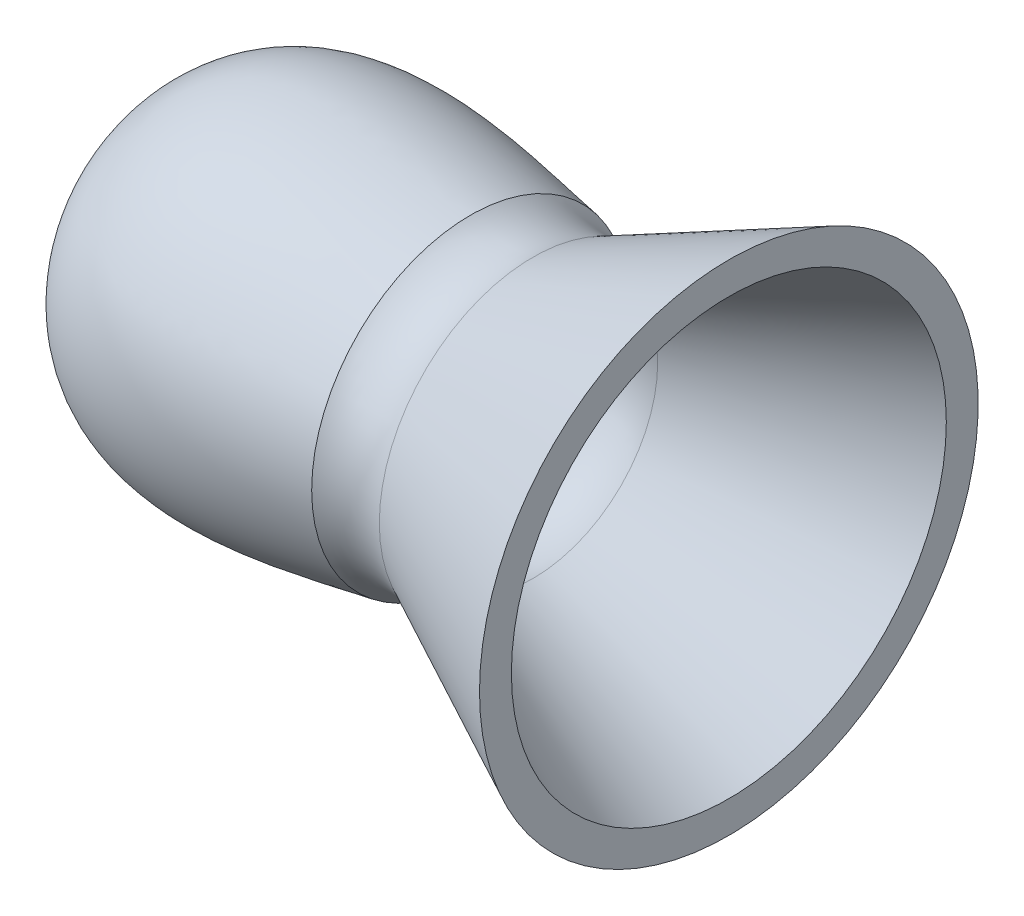
ISO-10303-21;
HEADER;
FILE_DESCRIPTION(('STEP AP214'),'2;1');
FILE_NAME('part.step','',(''),(''),'','','');
FILE_SCHEMA(('AUTOMOTIVE_DESIGN { 1 0 10303 214 1 1 1 1 }'));
ENDSEC;
DATA;
#1=APPLICATION_CONTEXT('core data for automotive mechanical design processes');
#2=APPLICATION_PROTOCOL_DEFINITION('international standard','automotive_design',2000,#1);
#3=PRODUCT_CONTEXT('',#1,'mechanical');
#4=PRODUCT('Part','Part','',(#3));
#5=PRODUCT_RELATED_PRODUCT_CATEGORY('part','',(#4));
#6=PRODUCT_DEFINITION_FORMATION('','',#4);
#7=PRODUCT_DEFINITION_CONTEXT('part definition',#1,'design');
#8=PRODUCT_DEFINITION('design','',#6,#7);
#9=PRODUCT_DEFINITION_SHAPE('','',#8);
#10=(LENGTH_UNIT() NAMED_UNIT(*) SI_UNIT(.MILLI.,.METRE.));
#11=(NAMED_UNIT(*) PLANE_ANGLE_UNIT() SI_UNIT($,.RADIAN.));
#12=(NAMED_UNIT(*) SI_UNIT($,.STERADIAN.) SOLID_ANGLE_UNIT());
#13=UNCERTAINTY_MEASURE_WITH_UNIT(LENGTH_MEASURE(1.E-05),#10,'distance_accuracy_value','');
#14=(GEOMETRIC_REPRESENTATION_CONTEXT(3) GLOBAL_UNCERTAINTY_ASSIGNED_CONTEXT((#13)) GLOBAL_UNIT_ASSIGNED_CONTEXT((#10,
#11,#12)) REPRESENTATION_CONTEXT('',''));
#15=CARTESIAN_POINT('',(0.,0.,0.));
#16=DIRECTION('',(0.,0.,1.));
#17=DIRECTION('',(1.,0.,0.));
#18=AXIS2_PLACEMENT_3D('',#15,#16,#17);
#19=CARTESIAN_POINT('',(107.744087580416,16.6640796611977,0.));
#20=CARTESIAN_POINT('',(72.0069480214439,22.8253804893952,0.));
#21=CARTESIAN_POINT('',(24.5386674175554,34.3214665265855,0.));
#22=CARTESIAN_POINT('',(0.,0.,0.));
#23=B_SPLINE_CURVE_WITH_KNOTS('',3,(#19,#20,#21,#22),.UNSPECIFIED.,.F.,.F.,(4,4),(0.,1.),.UNSPECIFIED.);
#24=CARTESIAN_POINT('',(129.454909333055,-38.3935633469682,0.));
#25=DIRECTION('',(-1.,0.,0.));
#26=AXIS1_PLACEMENT('',#24,#25);
#27=SURFACE_OF_REVOLUTION('',#23,#26);
#28=CARTESIAN_POINT('',(0.,-38.3935633469682,0.));
#29=DIRECTION('',(-1.,0.,0.));
#30=DIRECTION('',(0.,0.,1.));
#31=AXIS2_PLACEMENT_3D('',#28,#29,#30);
#32=CIRCLE('',#31,38.3935633469682);
#33=CARTESIAN_POINT('',(0.,-38.3935633469682,38.3935633469682));
#34=VERTEX_POINT('',#33);
#35=EDGE_CURVE('E10',#34,#34,#32,.T.);
#36=ORIENTED_EDGE('',*,*,#35,.F.);
#37=EDGE_LOOP('',(#36));
#38=FACE_BOUND('',#37,.T.);
#39=CARTESIAN_POINT('',(107.744087580416,-38.3935633469682,0.));
#40=DIRECTION('',(-1.,0.,0.));
#41=DIRECTION('',(0.,0.,1.));
#42=AXIS2_PLACEMENT_3D('',#39,#40,#41);
#43=CIRCLE('',#42,55.0576430081659);
#44=CARTESIAN_POINT('',(107.744087580416,-38.3935633469682,55.0576430081659));
#45=VERTEX_POINT('',#44);
#46=EDGE_CURVE('E83',#45,#45,#43,.T.);
#47=ORIENTED_EDGE('',*,*,#46,.T.);
#48=EDGE_LOOP('',(#47));
#49=FACE_BOUND('',#48,.T.);
#50=ADVANCED_FACE('F47',(#38,#49),#27,.T.);
#51=CARTESIAN_POINT('',(0.,-38.3935633469682,0.));
#52=DIRECTION('',(-1.,0.,0.));
#53=DIRECTION('',(0.,0.,1.));
#54=AXIS2_PLACEMENT_3D('',#51,#52,#53);
#55=CONICAL_SURFACE('',#54,38.3935633469682,0.620699526368393);
#56=CARTESIAN_POINT('',(8.13471808149453,-38.3935633469682,0.));
#57=DIRECTION('',(-1.,0.,0.));
#58=DIRECTION('',(0.,0.,1.));
#59=AXIS2_PLACEMENT_3D('',#56,#57,#58);
#60=CIRCLE('',#59,32.5775198692588);
#61=CARTESIAN_POINT('',(8.13471808149453,-38.3935633469682,32.5775198692588));
#62=VERTEX_POINT('',#61);
#63=EDGE_CURVE('E55',#62,#62,#60,.T.);
#64=ORIENTED_EDGE('',*,*,#63,.F.);
#65=EDGE_LOOP('',(#64));
#66=FACE_BOUND('',#65,.T.);
#67=ORIENTED_EDGE('',*,*,#35,.T.);
#68=EDGE_LOOP('',(#67));
#69=FACE_BOUND('',#68,.T.);
#70=ADVANCED_FACE('F101',(#66,#69),#55,.F.);
#71=CARTESIAN_POINT('',(8.13471808149453,-5.81604347770939,0.));
#72=CARTESIAN_POINT('',(8.44928182303202,-5.37607301224179,0.));
#73=CARTESIAN_POINT('',(9.09867656082205,-4.49935730892317,0.));
#74=CARTESIAN_POINT('',(10.4115762629824,-2.84838541166329,0.));
#75=CARTESIAN_POINT('',(12.1087415283629,-0.928077446039192,0.));
#76=CARTESIAN_POINT('',(14.2244162570632,1.15239357145514,0.));
#77=CARTESIAN_POINT('',(17.1559187147098,3.65614473331912,0.));
#78=CARTESIAN_POINT('',(21.033320819884,6.31833341310666,0.));
#79=CARTESIAN_POINT('',(26.0597099752327,8.8662144547587,0.));
#80=CARTESIAN_POINT('',(31.4819073161476,10.8293873985543,0.));
#81=CARTESIAN_POINT('',(39.2333483098484,12.721283269872,0.));
#82=CARTESIAN_POINT('',(49.8336337987627,13.8051225473219,0.));
#83=CARTESIAN_POINT('',(63.5845439992968,13.3866915562145,0.));
#84=CARTESIAN_POINT('',(75.4810215335111,11.9874051089734,0.));
#85=CARTESIAN_POINT('',(85.0258170491786,10.5048429114852,0.));
#86=CARTESIAN_POINT('',(92.1462995554624,9.28188718951444,0.));
#87=CARTESIAN_POINT('',(98.0026455965224,8.23055556395459,0.));
#88=CARTESIAN_POINT('',(102.628376471116,7.40509697641724,0.));
#89=CARTESIAN_POINT('',(104.902483802561,7.00645843926963,0.));
#90=CARTESIAN_POINT('',(106.04509204695,6.80946580893219,0.));
#91=B_SPLINE_CURVE_WITH_KNOTS('',3,(#71,#72,#73,#74,#75,#76,#77,#78,#79,#80,#81,#82,#83,#84,#85,
#86,#87,#88,#89,#90),.UNSPECIFIED.,.F.,.F.,(4,1,1,1,1,1,1,1,1,1,1,1,1,1,1,1,1,4),(0.,0.015625,
0.03125,0.0625,0.09375,0.125,0.1875,0.25,0.3125,0.375,0.5,0.625,0.75,0.8125,0.875,0.9375,
0.96875,1.),.UNSPECIFIED.);
#92=CARTESIAN_POINT('',(129.454909333055,-38.3935633469682,0.));
#93=DIRECTION('',(-1.,0.,0.));
#94=AXIS1_PLACEMENT('',#92,#93);
#95=SURFACE_OF_REVOLUTION('',#91,#94);
#96=CARTESIAN_POINT('',(106.04509204695,-38.3935633469682,0.));
#97=DIRECTION('',(-1.,0.,0.));
#98=DIRECTION('',(0.,0.,1.));
#99=AXIS2_PLACEMENT_3D('',#96,#97,#98);
#100=CIRCLE('',#99,45.2030291559004);
#101=CARTESIAN_POINT('',(106.04509204695,-38.3935633469682,45.2030291559004));
#102=VERTEX_POINT('',#101);
#103=EDGE_CURVE('E60',#102,#102,#100,.T.);
#104=ORIENTED_EDGE('',*,*,#103,.F.);
#105=EDGE_LOOP('',(#104));
#106=FACE_BOUND('',#105,.T.);
#107=ORIENTED_EDGE('',*,*,#63,.T.);
#108=EDGE_LOOP('',(#107));
#109=FACE_BOUND('',#108,.T.);
#110=ADVANCED_FACE('F97',(#106,#109),#95,.T.);
#111=CARTESIAN_POINT('',(119.292769245234,-38.3935633469682,0.));
#112=DIRECTION('',(-1.,0.,0.));
#113=DIRECTION('',(0.,0.,1.));
#114=AXIS2_PLACEMENT_3D('',#111,#112,#113);
#115=TOROIDAL_SURFACE('',#114,62.7972536878528,22.0240252458691);
#116=CARTESIAN_POINT('',(129.454909333055,-38.3935633469682,0.));
#117=DIRECTION('',(-1.,0.,0.));
#118=DIRECTION('',(0.,0.,1.));
#119=AXIS2_PLACEMENT_3D('',#116,#117,#118);
#120=CIRCLE('',#119,43.2578423132444);
#121=CARTESIAN_POINT('',(129.454909333055,-38.3935633469682,43.2578423132444));
#122=VERTEX_POINT('',#121);
#123=EDGE_CURVE('E65',#122,#122,#120,.T.);
#124=ORIENTED_EDGE('',*,*,#123,.F.);
#125=EDGE_LOOP('',(#124));
#126=FACE_BOUND('',#125,.T.);
#127=ORIENTED_EDGE('',*,*,#103,.T.);
#128=EDGE_LOOP('',(#127));
#129=FACE_BOUND('',#128,.T.);
#130=ADVANCED_FACE('F100',(#126,#129),#115,.T.);
#131=CARTESIAN_POINT('',(129.454909333055,-38.3935633469682,0.));
#132=DIRECTION('',(1.,0.,0.));
#133=DIRECTION('',(0.,0.,-1.));
#134=AXIS2_PLACEMENT_3D('',#131,#132,#133);
#135=CONICAL_SURFACE('',#134,43.2578423132444,0.44234536920547);
#136=CARTESIAN_POINT('',(197.394731404655,-38.3935633469682,0.));
#137=DIRECTION('',(-1.,0.,0.));
#138=DIRECTION('',(0.,0.,1.));
#139=AXIS2_PLACEMENT_3D('',#136,#137,#138);
#140=CIRCLE('',#139,75.4374631570319);
#141=CARTESIAN_POINT('',(197.394731404655,-38.3935633469682,75.4374631570319));
#142=VERTEX_POINT('',#141);
#143=EDGE_CURVE('E71',#142,#142,#140,.T.);
#144=ORIENTED_EDGE('',*,*,#143,.F.);
#145=EDGE_LOOP('',(#144));
#146=FACE_BOUND('',#145,.T.);
#147=ORIENTED_EDGE('',*,*,#123,.T.);
#148=EDGE_LOOP('',(#147));
#149=FACE_BOUND('',#148,.T.);
#150=ADVANCED_FACE('F128',(#146,#149),#135,.F.);
#151=CARTESIAN_POINT('',(197.394731404655,37.0438998100637,0.));
#152=DIRECTION('',(-1.,0.,0.));
#153=DIRECTION('',(0.,0.,1.));
#154=AXIS2_PLACEMENT_3D('',#151,#152,#153);
#155=PLANE('',#154);
#156=CARTESIAN_POINT('',(197.394731404655,-38.3935633469682,0.));
#157=DIRECTION('',(-1.,0.,0.));
#158=DIRECTION('',(0.,0.,1.));
#159=AXIS2_PLACEMENT_3D('',#156,#157,#158);
#160=CIRCLE('',#159,86.4940385234517);
#161=CARTESIAN_POINT('',(197.394731404655,-38.3935633469682,86.4940385234517));
#162=VERTEX_POINT('',#161);
#163=EDGE_CURVE('E75',#162,#162,#160,.T.);
#164=ORIENTED_EDGE('',*,*,#163,.F.);
#165=EDGE_LOOP('',(#164));
#166=FACE_BOUND('',#165,.T.);
#167=ORIENTED_EDGE('',*,*,#143,.T.);
#168=EDGE_LOOP('',(#167));
#169=FACE_BOUND('',#168,.T.);
#170=ADVANCED_FACE('F122',(#166,#169),#155,.F.);
#171=CARTESIAN_POINT('',(197.394731404655,-38.3935633469682,0.));
#172=DIRECTION('',(1.,0.,0.));
#173=DIRECTION('',(0.,0.,-1.));
#174=AXIS2_PLACEMENT_3D('',#171,#172,#173);
#175=CONICAL_SURFACE('',#174,86.4940385234517,0.454420477544738);
#176=CARTESIAN_POINT('',(129.454909333055,-38.3935633469682,0.));
#177=DIRECTION('',(-1.,0.,0.));
#178=DIRECTION('',(0.,0.,1.));
#179=AXIS2_PLACEMENT_3D('',#176,#177,#178);
#180=CIRCLE('',#179,53.3041629669146);
#181=CARTESIAN_POINT('',(129.454909333055,-38.3935633469682,53.3041629669146));
#182=VERTEX_POINT('',#181);
#183=EDGE_CURVE('E79',#182,#182,#180,.T.);
#184=ORIENTED_EDGE('',*,*,#183,.F.);
#185=EDGE_LOOP('',(#184));
#186=FACE_BOUND('',#185,.T.);
#187=ORIENTED_EDGE('',*,*,#163,.T.);
#188=EDGE_LOOP('',(#187));
#189=FACE_BOUND('',#188,.T.);
#190=ADVANCED_FACE('F116',(#186,#189),#175,.T.);
#191=CARTESIAN_POINT('',(120.078809256752,-38.3935633469682,0.));
#192=DIRECTION('',(-1.,0.,0.));
#193=DIRECTION('',(0.,0.,1.));
#194=AXIS2_PLACEMENT_3D('',#191,#192,#193);
#195=TOROIDAL_SURFACE('',#194,72.4970812960132,21.3606967730059);
#196=ORIENTED_EDGE('',*,*,#46,.F.);
#197=EDGE_LOOP('',(#196));
#198=FACE_BOUND('',#197,.T.);
#199=ORIENTED_EDGE('',*,*,#183,.T.);
#200=EDGE_LOOP('',(#199));
#201=FACE_BOUND('',#200,.T.);
#202=ADVANCED_FACE('F113',(#198,#201),#195,.F.);
#203=CLOSED_SHELL('',(#50,#70,#110,#130,#150,#170,#190,#202));
#204=MANIFOLD_SOLID_BREP('B2',#203);
#205=ADVANCED_BREP_SHAPE_REPRESENTATION('',(#18,#204),#14);
#206=SHAPE_DEFINITION_REPRESENTATION(#9,#205);
ENDSEC;
END-ISO-10303-21;
